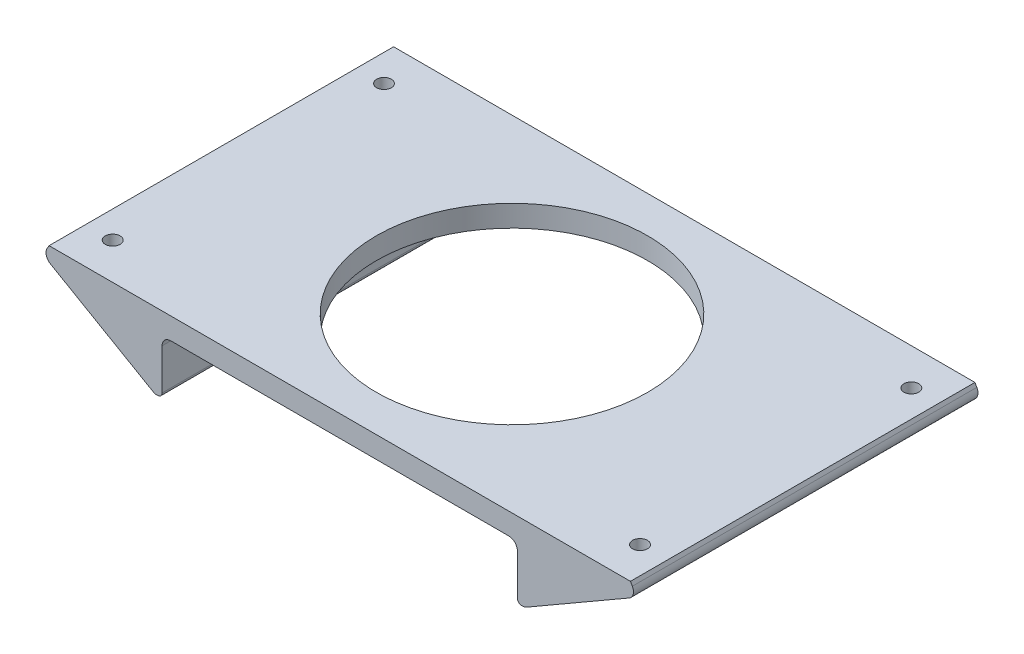
ISO-10303-21;
HEADER;
FILE_DESCRIPTION(('STEP AP214'),'2;1');
FILE_NAME('part.step','',(''),(''),'','','');
FILE_SCHEMA(('AUTOMOTIVE_DESIGN { 1 0 10303 214 1 1 1 1 }'));
ENDSEC;
DATA;
#1=APPLICATION_CONTEXT('core data for automotive mechanical design processes');
#2=APPLICATION_PROTOCOL_DEFINITION('international standard','automotive_design',2000,#1);
#3=PRODUCT_CONTEXT('',#1,'mechanical');
#4=PRODUCT('Part','Part','',(#3));
#5=PRODUCT_RELATED_PRODUCT_CATEGORY('part','',(#4));
#6=PRODUCT_DEFINITION_FORMATION('','',#4);
#7=PRODUCT_DEFINITION_CONTEXT('part definition',#1,'design');
#8=PRODUCT_DEFINITION('design','',#6,#7);
#9=PRODUCT_DEFINITION_SHAPE('','',#8);
#10=(LENGTH_UNIT() NAMED_UNIT(*) SI_UNIT(.MILLI.,.METRE.));
#11=(NAMED_UNIT(*) PLANE_ANGLE_UNIT() SI_UNIT($,.RADIAN.));
#12=(NAMED_UNIT(*) SI_UNIT($,.STERADIAN.) SOLID_ANGLE_UNIT());
#13=UNCERTAINTY_MEASURE_WITH_UNIT(LENGTH_MEASURE(1.E-05),#10,'distance_accuracy_value','');
#14=(GEOMETRIC_REPRESENTATION_CONTEXT(3) GLOBAL_UNCERTAINTY_ASSIGNED_CONTEXT((#13)) GLOBAL_UNIT_ASSIGNED_CONTEXT((#10,
#11,#12)) REPRESENTATION_CONTEXT('',''));
#15=CARTESIAN_POINT('',(0.,0.,0.));
#16=DIRECTION('',(0.,0.,1.));
#17=DIRECTION('',(1.,0.,0.));
#18=AXIS2_PLACEMENT_3D('',#15,#16,#17);
#19=CARTESIAN_POINT('',(-85.725,0.,101.6));
#20=DIRECTION('',(0.866025403784444,-0.49999999999999,0.));
#21=DIRECTION('',(0.49999999999999,0.866025403784444,0.));
#22=AXIS2_PLACEMENT_3D('',#19,#20,#21);
#23=PLANE('',#22);
#24=DIRECTION('',(-0.49999999999999,-0.866025403784444,0.));
#25=VECTOR('',#24,1.);
#26=CARTESIAN_POINT('',(-85.725,0.,0.));
#27=LINE('',#26,#25);
#28=CARTESIAN_POINT('',(-85.725,0.,0.));
#29=VERTEX_POINT('',#28);
#30=CARTESIAN_POINT('',(-86.288087104677,-0.975295474387556,0.));
#31=VERTEX_POINT('',#30);
#32=EDGE_CURVE('E205',#29,#31,#27,.T.);
#33=ORIENTED_EDGE('',*,*,#32,.T.);
#34=DIRECTION('',(0.,0.,-1.));
#35=VECTOR('',#34,1.);
#36=CARTESIAN_POINT('',(-86.288087104677,-0.975295474387557,101.6));
#37=LINE('',#36,#35);
#38=CARTESIAN_POINT('',(-86.288087104677,-0.975295474387556,101.6));
#39=VERTEX_POINT('',#38);
#40=EDGE_CURVE('E251',#31,#39,#37,.F.);
#41=ORIENTED_EDGE('',*,*,#40,.T.);
#42=DIRECTION('',(-0.49999999999999,-0.866025403784444,0.));
#43=VECTOR('',#42,1.);
#44=CARTESIAN_POINT('',(-85.725,0.,101.6));
#45=LINE('',#44,#43);
#46=CARTESIAN_POINT('',(-85.725,0.,101.6));
#47=VERTEX_POINT('',#46);
#48=EDGE_CURVE('E239',#47,#39,#45,.T.);
#49=ORIENTED_EDGE('',*,*,#48,.F.);
#50=DIRECTION('',(0.,0.,-1.));
#51=VECTOR('',#50,1.);
#52=CARTESIAN_POINT('',(-85.725,0.,101.6));
#53=LINE('',#52,#51);
#54=EDGE_CURVE('E194',#47,#29,#53,.T.);
#55=ORIENTED_EDGE('',*,*,#54,.T.);
#56=EDGE_LOOP('',(#33,#41,#49,#55));
#57=FACE_BOUND('',#56,.T.);
#58=ADVANCED_FACE('F45',(#57),#23,.F.);
#59=CARTESIAN_POINT('',(-87.558087104677,-3.17500000000003,101.6));
#60=DIRECTION('',(0.499999999999998,0.86602540378444,0.));
#61=DIRECTION('',(-0.86602540378444,0.499999999999998,0.));
#62=AXIS2_PLACEMENT_3D('',#59,#60,#61);
#63=PLANE('',#62);
#64=CARTESIAN_POINT('',(-77.75575,-8.83438196607273,10.795));
#65=DIRECTION('',(0.499999999999998,0.86602540378444,0.));
#66=DIRECTION('',(-0.86602540378444,0.499999999999998,0.));
#67=AXIS2_PLACEMENT_3D('',#64,#65,#66);
#68=ELLIPSE('',#67,2.52232785603563,2.1844);
#69=CARTESIAN_POINT('',(-79.94015,-7.57321803805492,10.795));
#70=VERTEX_POINT('',#69);
#71=EDGE_CURVE('E387',#70,#70,#68,.T.);
#72=ORIENTED_EDGE('',*,*,#71,.T.);
#73=EDGE_LOOP('',(#72));
#74=FACE_BOUND('',#73,.T.);
#75=CARTESIAN_POINT('',(-77.75575,-8.83438196607273,90.805));
#76=DIRECTION('',(0.499999999999998,0.86602540378444,0.));
#77=DIRECTION('',(-0.86602540378444,0.499999999999998,0.));
#78=AXIS2_PLACEMENT_3D('',#75,#76,#77);
#79=ELLIPSE('',#78,2.52232785603563,2.1844);
#80=CARTESIAN_POINT('',(-79.94015,-7.57321803805492,90.805));
#81=VERTEX_POINT('',#80);
#82=EDGE_CURVE('E391',#81,#81,#79,.T.);
#83=ORIENTED_EDGE('',*,*,#82,.T.);
#84=EDGE_LOOP('',(#83));
#85=FACE_BOUND('',#84,.T.);
#86=DIRECTION('',(0.86602540378444,-0.499999999999998,0.));
#87=VECTOR('',#86,1.);
#88=CARTESIAN_POINT('',(-87.558087104677,-3.17500000000003,0.));
#89=LINE('',#88,#87);
#90=CARTESIAN_POINT('',(-85.3583825790645,-4.44500000000002,0.));
#91=VERTEX_POINT('',#90);
#92=CARTESIAN_POINT('',(-54.8572237461023,-22.0548522628062,0.));
#93=VERTEX_POINT('',#92);
#94=EDGE_CURVE('E209',#91,#93,#89,.T.);
#95=ORIENTED_EDGE('',*,*,#94,.T.);
#96=DIRECTION('',(0.,0.,-1.));
#97=VECTOR('',#96,1.);
#98=CARTESIAN_POINT('',(-54.8572237461023,-22.0548522628062,101.6));
#99=LINE('',#98,#97);
#100=CARTESIAN_POINT('',(-54.8572237461023,-22.0548522628062,101.6));
#101=VERTEX_POINT('',#100);
#102=EDGE_CURVE('E313',#93,#101,#99,.F.);
#103=ORIENTED_EDGE('',*,*,#102,.T.);
#104=DIRECTION('',(0.86602540378444,-0.499999999999998,0.));
#105=VECTOR('',#104,1.);
#106=CARTESIAN_POINT('',(-87.558087104677,-3.17500000000003,101.6));
#107=LINE('',#106,#105);
#108=CARTESIAN_POINT('',(-85.3583825790645,-4.44500000000002,101.6));
#109=VERTEX_POINT('',#108);
#110=EDGE_CURVE('E375',#109,#101,#107,.T.);
#111=ORIENTED_EDGE('',*,*,#110,.F.);
#112=DIRECTION('',(0.,0.,-1.));
#113=VECTOR('',#112,1.);
#114=CARTESIAN_POINT('',(-85.3583825790645,-4.44500000000002,101.6));
#115=LINE('',#114,#113);
#116=EDGE_CURVE('E193',#109,#91,#115,.T.);
#117=ORIENTED_EDGE('',*,*,#116,.T.);
#118=EDGE_LOOP('',(#95,#103,#111,#117));
#119=FACE_BOUND('',#118,.T.);
#120=ADVANCED_FACE('F446',(#74,#85,#119),#63,.F.);
#121=CARTESIAN_POINT('',(-54.5625192204899,-22.2249999999999,101.6));
#122=DIRECTION('',(0.,1.,0.));
#123=DIRECTION('',(-1.,0.,0.));
#124=AXIS2_PLACEMENT_3D('',#121,#122,#123);
#125=PLANE('',#124);
#126=DIRECTION('',(1.,0.,0.));
#127=VECTOR('',#126,1.);
#128=CARTESIAN_POINT('',(-54.5625192204899,-22.2249999999999,101.6));
#129=LINE('',#128,#127);
#130=CARTESIAN_POINT('',(-54.2222237461023,-22.2249999999999,101.6));
#131=VERTEX_POINT('',#130);
#132=CARTESIAN_POINT('',(-53.6575,-22.2249999999999,101.6));
#133=VERTEX_POINT('',#132);
#134=EDGE_CURVE('E371',#131,#133,#129,.T.);
#135=ORIENTED_EDGE('',*,*,#134,.F.);
#136=DIRECTION('',(0.,0.,-1.));
#137=VECTOR('',#136,1.);
#138=CARTESIAN_POINT('',(-54.2222237461023,-22.2249999999999,101.6));
#139=LINE('',#138,#137);
#140=CARTESIAN_POINT('',(-54.2222237461023,-22.2249999999999,0.));
#141=VERTEX_POINT('',#140);
#142=EDGE_CURVE('E297',#131,#141,#139,.T.);
#143=ORIENTED_EDGE('',*,*,#142,.T.);
#144=DIRECTION('',(1.,0.,0.));
#145=VECTOR('',#144,1.);
#146=CARTESIAN_POINT('',(-54.5625192204899,-22.2249999999999,0.));
#147=LINE('',#146,#145);
#148=CARTESIAN_POINT('',(-53.6575,-22.2249999999999,0.));
#149=VERTEX_POINT('',#148);
#150=EDGE_CURVE('E214',#141,#149,#147,.T.);
#151=ORIENTED_EDGE('',*,*,#150,.T.);
#152=DIRECTION('',(0.,0.,-1.));
#153=VECTOR('',#152,1.);
#154=CARTESIAN_POINT('',(-53.6575,-22.2249999999999,101.6));
#155=LINE('',#154,#153);
#156=EDGE_CURVE('E294',#149,#133,#155,.F.);
#157=ORIENTED_EDGE('',*,*,#156,.T.);
#158=EDGE_LOOP('',(#135,#143,#151,#157));
#159=FACE_BOUND('',#158,.T.);
#160=ADVANCED_FACE('F452',(#159),#125,.F.);
#161=CARTESIAN_POINT('',(-52.3875,-22.2249999999999,101.6));
#162=DIRECTION('',(-1.,0.,0.));
#163=DIRECTION('',(0.,-1.,0.));
#164=AXIS2_PLACEMENT_3D('',#161,#162,#163);
#165=PLANE('',#164);
#166=DIRECTION('',(0.,1.,0.));
#167=VECTOR('',#166,1.);
#168=CARTESIAN_POINT('',(-52.3875,-22.2249999999999,101.6));
#169=LINE('',#168,#167);
#170=CARTESIAN_POINT('',(-52.3875,-20.9549999999999,101.6));
#171=VERTEX_POINT('',#170);
#172=CARTESIAN_POINT('',(-52.3875,-8.89000000000002,101.6));
#173=VERTEX_POINT('',#172);
#174=EDGE_CURVE('E368',#171,#173,#169,.T.);
#175=ORIENTED_EDGE('',*,*,#174,.F.);
#176=DIRECTION('',(0.,0.,-1.));
#177=VECTOR('',#176,1.);
#178=CARTESIAN_POINT('',(-52.3875,-20.9549999999999,101.6));
#179=LINE('',#178,#177);
#180=CARTESIAN_POINT('',(-52.3875,-20.9549999999999,0.));
#181=VERTEX_POINT('',#180);
#182=EDGE_CURVE('E327',#171,#181,#179,.T.);
#183=ORIENTED_EDGE('',*,*,#182,.T.);
#184=DIRECTION('',(0.,1.,0.));
#185=VECTOR('',#184,1.);
#186=CARTESIAN_POINT('',(-52.3875,-22.2249999999999,0.));
#187=LINE('',#186,#185);
#188=CARTESIAN_POINT('',(-52.3875,-8.89000000000002,0.));
#189=VERTEX_POINT('',#188);
#190=EDGE_CURVE('E218',#181,#189,#187,.T.);
#191=ORIENTED_EDGE('',*,*,#190,.T.);
#192=DIRECTION('',(0.,0.,-1.));
#193=VECTOR('',#192,1.);
#194=CARTESIAN_POINT('',(-52.3875,-8.89000000000002,101.6));
#195=LINE('',#194,#193);
#196=EDGE_CURVE('E273',#189,#173,#195,.F.);
#197=ORIENTED_EDGE('',*,*,#196,.T.);
#198=EDGE_LOOP('',(#175,#183,#191,#197));
#199=FACE_BOUND('',#198,.T.);
#200=ADVANCED_FACE('F503',(#199),#165,.F.);
#201=CARTESIAN_POINT('',(-52.3875,-6.35000000000002,101.6));
#202=DIRECTION('',(0.,1.,0.));
#203=DIRECTION('',(-1.,0.,0.));
#204=AXIS2_PLACEMENT_3D('',#201,#202,#203);
#205=PLANE('',#204);
#206=CARTESIAN_POINT('',(0.,-6.34999999999999,50.8));
#207=DIRECTION('',(0.,1.,0.));
#208=DIRECTION('',(-1.,0.,0.));
#209=AXIS2_PLACEMENT_3D('',#206,#207,#208);
#210=CIRCLE('',#209,40.005);
#211=CARTESIAN_POINT('',(-40.005,-6.35000000000001,50.8));
#212=VERTEX_POINT('',#211);
#213=EDGE_CURVE('E210',#212,#212,#210,.T.);
#214=ORIENTED_EDGE('',*,*,#213,.T.);
#215=EDGE_LOOP('',(#214));
#216=FACE_BOUND('',#215,.T.);
#217=DIRECTION('',(1.,0.,0.));
#218=VECTOR('',#217,1.);
#219=CARTESIAN_POINT('',(-52.3875,-6.35000000000002,101.6));
#220=LINE('',#219,#218);
#221=CARTESIAN_POINT('',(-49.8475,-6.35000000000002,101.6));
#222=VERTEX_POINT('',#221);
#223=CARTESIAN_POINT('',(49.8475,-6.34999999999996,101.6));
#224=VERTEX_POINT('',#223);
#225=EDGE_CURVE('E364',#222,#224,#220,.T.);
#226=ORIENTED_EDGE('',*,*,#225,.F.);
#227=DIRECTION('',(0.,0.,-1.));
#228=VECTOR('',#227,1.);
#229=CARTESIAN_POINT('',(-49.8475,-6.35000000000002,0.));
#230=LINE('',#229,#228);
#231=CARTESIAN_POINT('',(-49.8475,-6.35000000000002,0.));
#232=VERTEX_POINT('',#231);
#233=EDGE_CURVE('E269',#222,#232,#230,.T.);
#234=ORIENTED_EDGE('',*,*,#233,.T.);
#235=DIRECTION('',(1.,0.,0.));
#236=VECTOR('',#235,1.);
#237=CARTESIAN_POINT('',(-52.3875,-6.35000000000002,0.));
#238=LINE('',#237,#236);
#239=CARTESIAN_POINT('',(49.8475,-6.34999999999996,0.));
#240=VERTEX_POINT('',#239);
#241=EDGE_CURVE('E221',#232,#240,#238,.T.);
#242=ORIENTED_EDGE('',*,*,#241,.T.);
#243=DIRECTION('',(0.,0.,-1.));
#244=VECTOR('',#243,1.);
#245=CARTESIAN_POINT('',(49.8475,-6.34999999999996,101.6));
#246=LINE('',#245,#244);
#247=EDGE_CURVE('E266',#240,#224,#246,.F.);
#248=ORIENTED_EDGE('',*,*,#247,.T.);
#249=EDGE_LOOP('',(#226,#234,#242,#248));
#250=FACE_BOUND('',#249,.T.);
#251=ADVANCED_FACE('F496',(#216,#250),#205,.F.);
#252=CARTESIAN_POINT('',(52.3875,-22.2249999999999,101.6));
#253=DIRECTION('',(1.,0.,0.));
#254=DIRECTION('',(0.,1.,0.));
#255=AXIS2_PLACEMENT_3D('',#252,#253,#254);
#256=PLANE('',#255);
#257=DIRECTION('',(0.,-1.,0.));
#258=VECTOR('',#257,1.);
#259=CARTESIAN_POINT('',(52.3875,-22.2249999999999,0.));
#260=LINE('',#259,#258);
#261=CARTESIAN_POINT('',(52.3875,-8.88999999999996,0.));
#262=VERTEX_POINT('',#261);
#263=CARTESIAN_POINT('',(52.3875,-20.9549999999999,0.));
#264=VERTEX_POINT('',#263);
#265=EDGE_CURVE('E225',#262,#264,#260,.T.);
#266=ORIENTED_EDGE('',*,*,#265,.T.);
#267=DIRECTION('',(0.,0.,-1.));
#268=VECTOR('',#267,1.);
#269=CARTESIAN_POINT('',(52.3875,-20.9549999999999,101.6));
#270=LINE('',#269,#268);
#271=CARTESIAN_POINT('',(52.3875,-20.9549999999999,101.6));
#272=VERTEX_POINT('',#271);
#273=EDGE_CURVE('E11',#264,#272,#270,.F.);
#274=ORIENTED_EDGE('',*,*,#273,.T.);
#275=DIRECTION('',(0.,-1.,0.));
#276=VECTOR('',#275,1.);
#277=CARTESIAN_POINT('',(52.3875,-22.2249999999999,101.6));
#278=LINE('',#277,#276);
#279=CARTESIAN_POINT('',(52.3875,-8.88999999999996,101.6));
#280=VERTEX_POINT('',#279);
#281=EDGE_CURVE('E358',#280,#272,#278,.T.);
#282=ORIENTED_EDGE('',*,*,#281,.F.);
#283=DIRECTION('',(0.,0.,-1.));
#284=VECTOR('',#283,1.);
#285=CARTESIAN_POINT('',(52.3875,-8.88999999999996,0.));
#286=LINE('',#285,#284);
#287=EDGE_CURVE('E277',#280,#262,#286,.T.);
#288=ORIENTED_EDGE('',*,*,#287,.T.);
#289=EDGE_LOOP('',(#266,#274,#282,#288));
#290=FACE_BOUND('',#289,.T.);
#291=ADVANCED_FACE('F443',(#290),#256,.F.);
#292=CARTESIAN_POINT('',(54.5625192204899,-22.2249999999999,101.6));
#293=DIRECTION('',(0.,1.,0.));
#294=DIRECTION('',(-1.,0.,0.));
#295=AXIS2_PLACEMENT_3D('',#292,#293,#294);
#296=PLANE('',#295);
#297=DIRECTION('',(1.,0.,0.));
#298=VECTOR('',#297,1.);
#299=CARTESIAN_POINT('',(54.5625192204899,-22.2249999999999,0.));
#300=LINE('',#299,#298);
#301=CARTESIAN_POINT('',(53.6575,-22.2249999999999,0.));
#302=VERTEX_POINT('',#301);
#303=CARTESIAN_POINT('',(54.2222237461023,-22.2249999999999,0.));
#304=VERTEX_POINT('',#303);
#305=EDGE_CURVE('E229',#302,#304,#300,.T.);
#306=ORIENTED_EDGE('',*,*,#305,.T.);
#307=DIRECTION('',(0.,0.,-1.));
#308=VECTOR('',#307,1.);
#309=CARTESIAN_POINT('',(54.2222237461023,-22.2249999999999,101.6));
#310=LINE('',#309,#308);
#311=CARTESIAN_POINT('',(54.2222237461023,-22.2249999999999,101.6));
#312=VERTEX_POINT('',#311);
#313=EDGE_CURVE('E54',#304,#312,#310,.F.);
#314=ORIENTED_EDGE('',*,*,#313,.T.);
#315=DIRECTION('',(1.,0.,0.));
#316=VECTOR('',#315,1.);
#317=CARTESIAN_POINT('',(54.5625192204899,-22.2249999999999,101.6));
#318=LINE('',#317,#316);
#319=CARTESIAN_POINT('',(53.6575,-22.2249999999999,101.6));
#320=VERTEX_POINT('',#319);
#321=EDGE_CURVE('E342',#320,#312,#318,.T.);
#322=ORIENTED_EDGE('',*,*,#321,.F.);
#323=DIRECTION('',(0.,0.,-1.));
#324=VECTOR('',#323,1.);
#325=CARTESIAN_POINT('',(53.6575,-22.2249999999999,101.6));
#326=LINE('',#325,#324);
#327=EDGE_CURVE('E335',#320,#302,#326,.T.);
#328=ORIENTED_EDGE('',*,*,#327,.T.);
#329=EDGE_LOOP('',(#306,#314,#322,#328));
#330=FACE_BOUND('',#329,.T.);
#331=ADVANCED_FACE('F341',(#330),#296,.F.);
#332=CARTESIAN_POINT('',(87.558087104677,-3.17500000000001,101.6));
#333=DIRECTION('',(-0.499999999999998,0.86602540378444,0.));
#334=DIRECTION('',(-0.86602540378444,-0.499999999999998,0.));
#335=AXIS2_PLACEMENT_3D('',#332,#333,#334);
#336=PLANE('',#335);
#337=CARTESIAN_POINT('',(77.75575,-8.83438196607271,10.795));
#338=DIRECTION('',(-0.499999999999998,0.86602540378444,0.));
#339=DIRECTION('',(0.86602540378444,0.499999999999998,0.));
#340=AXIS2_PLACEMENT_3D('',#337,#338,#339);
#341=ELLIPSE('',#340,2.52232785603563,2.1844);
#342=CARTESIAN_POINT('',(79.94015,-7.5732180380549,10.795));
#343=VERTEX_POINT('',#342);
#344=EDGE_CURVE('E383',#343,#343,#341,.T.);
#345=ORIENTED_EDGE('',*,*,#344,.T.);
#346=EDGE_LOOP('',(#345));
#347=FACE_BOUND('',#346,.T.);
#348=CARTESIAN_POINT('',(77.75575,-8.8343819660727,90.805));
#349=DIRECTION('',(-0.499999999999998,0.86602540378444,0.));
#350=DIRECTION('',(0.86602540378444,0.499999999999998,0.));
#351=AXIS2_PLACEMENT_3D('',#348,#349,#350);
#352=ELLIPSE('',#351,2.52232785603563,2.1844);
#353=CARTESIAN_POINT('',(79.94015,-7.57321803805489,90.805));
#354=VERTEX_POINT('',#353);
#355=EDGE_CURVE('E395',#354,#354,#352,.T.);
#356=ORIENTED_EDGE('',*,*,#355,.T.);
#357=EDGE_LOOP('',(#356));
#358=FACE_BOUND('',#357,.T.);
#359=DIRECTION('',(0.86602540378444,0.499999999999998,0.));
#360=VECTOR('',#359,1.);
#361=CARTESIAN_POINT('',(87.558087104677,-3.17500000000001,101.6));
#362=LINE('',#361,#360);
#363=CARTESIAN_POINT('',(54.8572237461023,-22.0548522628061,101.6));
#364=VERTEX_POINT('',#363);
#365=CARTESIAN_POINT('',(85.3583825790645,-4.44499999999999,101.6));
#366=VERTEX_POINT('',#365);
#367=EDGE_CURVE('E183',#364,#366,#362,.T.);
#368=ORIENTED_EDGE('',*,*,#367,.F.);
#369=DIRECTION('',(0.,0.,-1.));
#370=VECTOR('',#369,1.);
#371=CARTESIAN_POINT('',(54.8572237461023,-22.0548522628062,101.6));
#372=LINE('',#371,#370);
#373=CARTESIAN_POINT('',(54.8572237461023,-22.0548522628061,0.));
#374=VERTEX_POINT('',#373);
#375=EDGE_CURVE('E331',#364,#374,#372,.T.);
#376=ORIENTED_EDGE('',*,*,#375,.T.);
#377=DIRECTION('',(0.86602540378444,0.499999999999998,0.));
#378=VECTOR('',#377,1.);
#379=CARTESIAN_POINT('',(87.558087104677,-3.17500000000001,0.));
#380=LINE('',#379,#378);
#381=CARTESIAN_POINT('',(85.3583825790645,-4.44499999999999,0.));
#382=VERTEX_POINT('',#381);
#383=EDGE_CURVE('E232',#374,#382,#380,.T.);
#384=ORIENTED_EDGE('',*,*,#383,.T.);
#385=DIRECTION('',(0.,0.,-1.));
#386=VECTOR('',#385,1.);
#387=CARTESIAN_POINT('',(85.3583825790645,-4.44499999999999,101.6));
#388=LINE('',#387,#386);
#389=EDGE_CURVE('E262',#382,#366,#388,.F.);
#390=ORIENTED_EDGE('',*,*,#389,.T.);
#391=EDGE_LOOP('',(#368,#376,#384,#390));
#392=FACE_BOUND('',#391,.T.);
#393=ADVANCED_FACE('F354',(#347,#358,#392),#336,.F.);
#394=CARTESIAN_POINT('',(85.725,0.,101.6));
#395=DIRECTION('',(-0.866025403784443,-0.499999999999993,0.));
#396=DIRECTION('',(0.499999999999993,-0.866025403784443,0.));
#397=AXIS2_PLACEMENT_3D('',#394,#395,#396);
#398=PLANE('',#397);
#399=DIRECTION('',(-0.499999999999993,0.866025403784443,0.));
#400=VECTOR('',#399,1.);
#401=CARTESIAN_POINT('',(85.725,0.,101.6));
#402=LINE('',#401,#400);
#403=CARTESIAN_POINT('',(86.288087104677,-0.975295474387529,101.6));
#404=VERTEX_POINT('',#403);
#405=CARTESIAN_POINT('',(85.725,0.,101.6));
#406=VERTEX_POINT('',#405);
#407=EDGE_CURVE('E169',#404,#406,#402,.T.);
#408=ORIENTED_EDGE('',*,*,#407,.F.);
#409=DIRECTION('',(0.,0.,-1.));
#410=VECTOR('',#409,1.);
#411=CARTESIAN_POINT('',(86.288087104677,-0.975295474387531,101.6));
#412=LINE('',#411,#410);
#413=CARTESIAN_POINT('',(86.288087104677,-0.975295474387529,0.));
#414=VERTEX_POINT('',#413);
#415=EDGE_CURVE('E259',#404,#414,#412,.T.);
#416=ORIENTED_EDGE('',*,*,#415,.T.);
#417=DIRECTION('',(-0.499999999999993,0.866025403784443,0.));
#418=VECTOR('',#417,1.);
#419=CARTESIAN_POINT('',(85.725,0.,0.));
#420=LINE('',#419,#418);
#421=CARTESIAN_POINT('',(85.725,0.,0.));
#422=VERTEX_POINT('',#421);
#423=EDGE_CURVE('E189',#414,#422,#420,.T.);
#424=ORIENTED_EDGE('',*,*,#423,.T.);
#425=DIRECTION('',(0.,0.,-1.));
#426=VECTOR('',#425,1.);
#427=CARTESIAN_POINT('',(85.725,0.,101.6));
#428=LINE('',#427,#426);
#429=EDGE_CURVE('E186',#406,#422,#428,.T.);
#430=ORIENTED_EDGE('',*,*,#429,.F.);
#431=EDGE_LOOP('',(#408,#416,#424,#430));
#432=FACE_BOUND('',#431,.T.);
#433=ADVANCED_FACE('F187',(#432),#398,.F.);
#434=CARTESIAN_POINT('',(85.725,0.,101.6));
#435=DIRECTION('',(0.,-1.,0.));
#436=DIRECTION('',(1.,0.,0.));
#437=AXIS2_PLACEMENT_3D('',#434,#435,#436);
#438=PLANE('',#437);
#439=CARTESIAN_POINT('',(0.,0.,50.8));
#440=DIRECTION('',(0.,1.,0.));
#441=DIRECTION('',(-1.,0.,0.));
#442=AXIS2_PLACEMENT_3D('',#439,#440,#441);
#443=CIRCLE('',#442,40.005);
#444=CARTESIAN_POINT('',(-40.005,0.,50.8));
#445=VERTEX_POINT('',#444);
#446=EDGE_CURVE('E404',#445,#445,#443,.T.);
#447=ORIENTED_EDGE('',*,*,#446,.F.);
#448=EDGE_LOOP('',(#447));
#449=FACE_BOUND('',#448,.T.);
#450=CARTESIAN_POINT('',(77.75575,0.,10.795));
#451=DIRECTION('',(0.,1.,0.));
#452=DIRECTION('',(1.,0.,0.));
#453=AXIS2_PLACEMENT_3D('',#450,#451,#452);
#454=CIRCLE('',#453,2.1844);
#455=CARTESIAN_POINT('',(79.94015,0.,10.795));
#456=VERTEX_POINT('',#455);
#457=EDGE_CURVE('E408',#456,#456,#454,.T.);
#458=ORIENTED_EDGE('',*,*,#457,.F.);
#459=EDGE_LOOP('',(#458));
#460=FACE_BOUND('',#459,.T.);
#461=CARTESIAN_POINT('',(-77.75575,0.,10.795));
#462=DIRECTION('',(0.,1.,0.));
#463=DIRECTION('',(-1.,0.,0.));
#464=AXIS2_PLACEMENT_3D('',#461,#462,#463);
#465=CIRCLE('',#464,2.1844);
#466=CARTESIAN_POINT('',(-79.94015,0.,10.795));
#467=VERTEX_POINT('',#466);
#468=EDGE_CURVE('E412',#467,#467,#465,.T.);
#469=ORIENTED_EDGE('',*,*,#468,.F.);
#470=EDGE_LOOP('',(#469));
#471=FACE_BOUND('',#470,.T.);
#472=CARTESIAN_POINT('',(-77.75575,0.,90.805));
#473=DIRECTION('',(0.,1.,0.));
#474=DIRECTION('',(1.,0.,0.));
#475=AXIS2_PLACEMENT_3D('',#472,#473,#474);
#476=CIRCLE('',#475,2.1844);
#477=CARTESIAN_POINT('',(-75.57135,0.,90.805));
#478=VERTEX_POINT('',#477);
#479=EDGE_CURVE('E403',#478,#478,#476,.T.);
#480=ORIENTED_EDGE('',*,*,#479,.F.);
#481=EDGE_LOOP('',(#480));
#482=FACE_BOUND('',#481,.T.);
#483=CARTESIAN_POINT('',(77.75575,0.,90.805));
#484=DIRECTION('',(0.,1.,0.));
#485=DIRECTION('',(-1.,0.,0.));
#486=AXIS2_PLACEMENT_3D('',#483,#484,#485);
#487=CIRCLE('',#486,2.1844);
#488=CARTESIAN_POINT('',(75.57135,0.,90.805));
#489=VERTEX_POINT('',#488);
#490=EDGE_CURVE('E399',#489,#489,#487,.T.);
#491=ORIENTED_EDGE('',*,*,#490,.F.);
#492=EDGE_LOOP('',(#491));
#493=FACE_BOUND('',#492,.T.);
#494=DIRECTION('',(-1.,0.,0.));
#495=VECTOR('',#494,1.);
#496=CARTESIAN_POINT('',(85.725,0.,0.));
#497=LINE('',#496,#495);
#498=EDGE_CURVE('E237',#422,#29,#497,.T.);
#499=ORIENTED_EDGE('',*,*,#498,.T.);
#500=ORIENTED_EDGE('',*,*,#54,.F.);
#501=DIRECTION('',(-1.,0.,0.));
#502=VECTOR('',#501,1.);
#503=CARTESIAN_POINT('',(85.725,0.,101.6));
#504=LINE('',#503,#502);
#505=EDGE_CURVE('E175',#406,#47,#504,.T.);
#506=ORIENTED_EDGE('',*,*,#505,.F.);
#507=ORIENTED_EDGE('',*,*,#429,.T.);
#508=EDGE_LOOP('',(#499,#500,#506,#507));
#509=FACE_BOUND('',#508,.T.);
#510=ADVANCED_FACE('F196',(#449,#460,#471,#482,#493,#509),#438,.F.);
#511=CARTESIAN_POINT('',(0.,0.,101.6));
#512=DIRECTION('',(0.,0.,1.));
#513=DIRECTION('',(1.,0.,0.));
#514=AXIS2_PLACEMENT_3D('',#511,#512,#513);
#515=PLANE('',#514);
#516=ORIENTED_EDGE('',*,*,#110,.T.);
#517=CARTESIAN_POINT('',(-54.2222237461023,-20.9549999999999,101.6));
#518=DIRECTION('',(0.,0.,1.));
#519=DIRECTION('',(1.,0.,0.));
#520=AXIS2_PLACEMENT_3D('',#517,#518,#519);
#521=CIRCLE('',#520,1.27);
#522=EDGE_CURVE('E324',#101,#131,#521,.T.);
#523=ORIENTED_EDGE('',*,*,#522,.T.);
#524=ORIENTED_EDGE('',*,*,#134,.T.);
#525=CARTESIAN_POINT('',(-53.6575,-20.9549999999999,101.6));
#526=DIRECTION('',(0.,0.,1.));
#527=DIRECTION('',(1.,0.,0.));
#528=AXIS2_PLACEMENT_3D('',#525,#526,#527);
#529=CIRCLE('',#528,1.27);
#530=EDGE_CURVE('E321',#133,#171,#529,.T.);
#531=ORIENTED_EDGE('',*,*,#530,.T.);
#532=ORIENTED_EDGE('',*,*,#174,.T.);
#533=CARTESIAN_POINT('',(-49.8475,-8.89000000000002,101.6));
#534=DIRECTION('',(0.,0.,1.));
#535=DIRECTION('',(1.,0.,0.));
#536=AXIS2_PLACEMENT_3D('',#533,#534,#535);
#537=CIRCLE('',#536,2.54);
#538=EDGE_CURVE('E285',#173,#222,#537,.F.);
#539=ORIENTED_EDGE('',*,*,#538,.T.);
#540=ORIENTED_EDGE('',*,*,#225,.T.);
#541=CARTESIAN_POINT('',(49.8475,-8.88999999999996,101.6));
#542=DIRECTION('',(0.,0.,1.));
#543=DIRECTION('',(1.,0.,0.));
#544=AXIS2_PLACEMENT_3D('',#541,#542,#543);
#545=CIRCLE('',#544,2.54);
#546=EDGE_CURVE('E291',#224,#280,#545,.F.);
#547=ORIENTED_EDGE('',*,*,#546,.T.);
#548=ORIENTED_EDGE('',*,*,#281,.T.);
#549=CARTESIAN_POINT('',(53.6575,-20.9549999999999,101.6));
#550=DIRECTION('',(0.,0.,1.));
#551=DIRECTION('',(1.,0.,0.));
#552=AXIS2_PLACEMENT_3D('',#549,#550,#551);
#553=CIRCLE('',#552,1.27);
#554=EDGE_CURVE('E316',#272,#320,#553,.T.);
#555=ORIENTED_EDGE('',*,*,#554,.T.);
#556=ORIENTED_EDGE('',*,*,#321,.T.);
#557=CARTESIAN_POINT('',(54.2222237461023,-20.9549999999999,101.6));
#558=DIRECTION('',(0.,0.,1.));
#559=DIRECTION('',(1.,0.,0.));
#560=AXIS2_PLACEMENT_3D('',#557,#558,#559);
#561=CIRCLE('',#560,1.27);
#562=EDGE_CURVE('E61',#312,#364,#561,.T.);
#563=ORIENTED_EDGE('',*,*,#562,.T.);
#564=ORIENTED_EDGE('',*,*,#367,.T.);
#565=CARTESIAN_POINT('',(84.0883825790645,-2.24529547438751,101.6));
#566=DIRECTION('',(0.,0.,1.));
#567=DIRECTION('',(1.,0.,0.));
#568=AXIS2_PLACEMENT_3D('',#565,#566,#567);
#569=CIRCLE('',#568,2.54);
#570=EDGE_CURVE('E178',#366,#404,#569,.T.);
#571=ORIENTED_EDGE('',*,*,#570,.T.);
#572=ORIENTED_EDGE('',*,*,#407,.T.);
#573=ORIENTED_EDGE('',*,*,#505,.T.);
#574=ORIENTED_EDGE('',*,*,#48,.T.);
#575=CARTESIAN_POINT('',(-84.0883825790645,-2.24529547438754,101.6));
#576=DIRECTION('',(0.,0.,1.));
#577=DIRECTION('',(1.,0.,0.));
#578=AXIS2_PLACEMENT_3D('',#575,#576,#577);
#579=CIRCLE('',#578,2.54);
#580=EDGE_CURVE('E256',#39,#109,#579,.T.);
#581=ORIENTED_EDGE('',*,*,#580,.T.);
#582=EDGE_LOOP('',(#516,#523,#524,#531,#532,#539,#540,#547,#548,#555,#556,#563,#564,#571,#572,
#573,#574,#581));
#583=FACE_BOUND('',#582,.T.);
#584=ADVANCED_FACE('F172',(#583),#515,.T.);
#585=CARTESIAN_POINT('',(0.,0.,0.));
#586=DIRECTION('',(0.,0.,1.));
#587=DIRECTION('',(1.,0.,0.));
#588=AXIS2_PLACEMENT_3D('',#585,#586,#587);
#589=PLANE('',#588);
#590=ORIENTED_EDGE('',*,*,#150,.F.);
#591=CARTESIAN_POINT('',(-54.2222237461023,-20.9549999999999,0.));
#592=DIRECTION('',(0.,0.,1.));
#593=DIRECTION('',(1.,0.,0.));
#594=AXIS2_PLACEMENT_3D('',#591,#592,#593);
#595=CIRCLE('',#594,1.27);
#596=EDGE_CURVE('E310',#141,#93,#595,.F.);
#597=ORIENTED_EDGE('',*,*,#596,.T.);
#598=ORIENTED_EDGE('',*,*,#94,.F.);
#599=CARTESIAN_POINT('',(-84.0883825790645,-2.24529547438754,0.));
#600=DIRECTION('',(0.,0.,1.));
#601=DIRECTION('',(1.,0.,0.));
#602=AXIS2_PLACEMENT_3D('',#599,#600,#601);
#603=CIRCLE('',#602,2.54);
#604=EDGE_CURVE('E248',#91,#31,#603,.F.);
#605=ORIENTED_EDGE('',*,*,#604,.T.);
#606=ORIENTED_EDGE('',*,*,#32,.F.);
#607=ORIENTED_EDGE('',*,*,#498,.F.);
#608=ORIENTED_EDGE('',*,*,#423,.F.);
#609=CARTESIAN_POINT('',(84.0883825790645,-2.24529547438751,0.));
#610=DIRECTION('',(0.,0.,1.));
#611=DIRECTION('',(1.,0.,0.));
#612=AXIS2_PLACEMENT_3D('',#609,#610,#611);
#613=CIRCLE('',#612,2.54);
#614=EDGE_CURVE('E244',#414,#382,#613,.F.);
#615=ORIENTED_EDGE('',*,*,#614,.T.);
#616=ORIENTED_EDGE('',*,*,#383,.F.);
#617=CARTESIAN_POINT('',(54.2222237461023,-20.9549999999999,0.));
#618=DIRECTION('',(0.,0.,1.));
#619=DIRECTION('',(1.,0.,0.));
#620=AXIS2_PLACEMENT_3D('',#617,#618,#619);
#621=CIRCLE('',#620,1.27);
#622=EDGE_CURVE('E304',#374,#304,#621,.F.);
#623=ORIENTED_EDGE('',*,*,#622,.T.);
#624=ORIENTED_EDGE('',*,*,#305,.F.);
#625=CARTESIAN_POINT('',(53.6575,-20.9549999999999,0.));
#626=DIRECTION('',(0.,0.,1.));
#627=DIRECTION('',(1.,0.,0.));
#628=AXIS2_PLACEMENT_3D('',#625,#626,#627);
#629=CIRCLE('',#628,1.27);
#630=EDGE_CURVE('E301',#302,#264,#629,.F.);
#631=ORIENTED_EDGE('',*,*,#630,.T.);
#632=ORIENTED_EDGE('',*,*,#265,.F.);
#633=CARTESIAN_POINT('',(49.8475,-8.88999999999996,0.));
#634=DIRECTION('',(0.,0.,1.));
#635=DIRECTION('',(1.,0.,0.));
#636=AXIS2_PLACEMENT_3D('',#633,#634,#635);
#637=CIRCLE('',#636,2.54);
#638=EDGE_CURVE('E288',#262,#240,#637,.T.);
#639=ORIENTED_EDGE('',*,*,#638,.T.);
#640=ORIENTED_EDGE('',*,*,#241,.F.);
#641=CARTESIAN_POINT('',(-49.8475,-8.89000000000002,0.));
#642=DIRECTION('',(0.,0.,1.));
#643=DIRECTION('',(1.,0.,0.));
#644=AXIS2_PLACEMENT_3D('',#641,#642,#643);
#645=CIRCLE('',#644,2.54);
#646=EDGE_CURVE('E281',#232,#189,#645,.T.);
#647=ORIENTED_EDGE('',*,*,#646,.T.);
#648=ORIENTED_EDGE('',*,*,#190,.F.);
#649=CARTESIAN_POINT('',(-53.6575,-20.9549999999999,0.));
#650=DIRECTION('',(0.,0.,1.));
#651=DIRECTION('',(1.,0.,0.));
#652=AXIS2_PLACEMENT_3D('',#649,#650,#651);
#653=CIRCLE('',#652,1.27);
#654=EDGE_CURVE('E307',#181,#149,#653,.F.);
#655=ORIENTED_EDGE('',*,*,#654,.T.);
#656=EDGE_LOOP('',(#590,#597,#598,#605,#606,#607,#608,#615,#616,#623,#624,#631,#632,#639,#640,
#647,#648,#655));
#657=FACE_BOUND('',#656,.T.);
#658=ADVANCED_FACE('F347',(#657),#589,.F.);
#659=CARTESIAN_POINT('',(77.75575,-22.2249999999999,90.805));
#660=DIRECTION('',(0.,1.,0.));
#661=DIRECTION('',(-1.,0.,0.));
#662=AXIS2_PLACEMENT_3D('',#659,#660,#661);
#663=CYLINDRICAL_SURFACE('',#662,2.1844);
#664=ORIENTED_EDGE('',*,*,#490,.T.);
#665=EDGE_LOOP('',(#664));
#666=FACE_BOUND('',#665,.T.);
#667=ORIENTED_EDGE('',*,*,#355,.F.);
#668=EDGE_LOOP('',(#667));
#669=FACE_BOUND('',#668,.T.);
#670=ADVANCED_FACE('F429',(#666,#669),#663,.F.);
#671=CARTESIAN_POINT('',(-77.75575,-22.225,90.805));
#672=DIRECTION('',(0.,1.,0.));
#673=DIRECTION('',(-1.,0.,0.));
#674=AXIS2_PLACEMENT_3D('',#671,#672,#673);
#675=CYLINDRICAL_SURFACE('',#674,2.1844);
#676=ORIENTED_EDGE('',*,*,#479,.T.);
#677=EDGE_LOOP('',(#676));
#678=FACE_BOUND('',#677,.T.);
#679=ORIENTED_EDGE('',*,*,#82,.F.);
#680=EDGE_LOOP('',(#679));
#681=FACE_BOUND('',#680,.T.);
#682=ADVANCED_FACE('F420',(#678,#681),#675,.F.);
#683=CARTESIAN_POINT('',(-77.75575,-22.225,10.795));
#684=DIRECTION('',(0.,1.,0.));
#685=DIRECTION('',(-1.,0.,0.));
#686=AXIS2_PLACEMENT_3D('',#683,#684,#685);
#687=CYLINDRICAL_SURFACE('',#686,2.1844);
#688=ORIENTED_EDGE('',*,*,#468,.T.);
#689=EDGE_LOOP('',(#688));
#690=FACE_BOUND('',#689,.T.);
#691=ORIENTED_EDGE('',*,*,#71,.F.);
#692=EDGE_LOOP('',(#691));
#693=FACE_BOUND('',#692,.T.);
#694=ADVANCED_FACE('F587',(#690,#693),#687,.F.);
#695=CARTESIAN_POINT('',(77.75575,-22.2249999999999,10.795));
#696=DIRECTION('',(0.,1.,0.));
#697=DIRECTION('',(-1.,0.,0.));
#698=AXIS2_PLACEMENT_3D('',#695,#696,#697);
#699=CYLINDRICAL_SURFACE('',#698,2.1844);
#700=ORIENTED_EDGE('',*,*,#457,.T.);
#701=EDGE_LOOP('',(#700));
#702=FACE_BOUND('',#701,.T.);
#703=ORIENTED_EDGE('',*,*,#344,.F.);
#704=EDGE_LOOP('',(#703));
#705=FACE_BOUND('',#704,.T.);
#706=ADVANCED_FACE('F596',(#702,#705),#699,.F.);
#707=CARTESIAN_POINT('',(0.,-22.2249999999999,50.8));
#708=DIRECTION('',(0.,1.,0.));
#709=DIRECTION('',(-1.,0.,0.));
#710=AXIS2_PLACEMENT_3D('',#707,#708,#709);
#711=CYLINDRICAL_SURFACE('',#710,40.005);
#712=ORIENTED_EDGE('',*,*,#446,.T.);
#713=EDGE_LOOP('',(#712));
#714=FACE_BOUND('',#713,.T.);
#715=ORIENTED_EDGE('',*,*,#213,.F.);
#716=EDGE_LOOP('',(#715));
#717=FACE_BOUND('',#716,.T.);
#718=ADVANCED_FACE('F461',(#714,#717),#711,.F.);
#719=CARTESIAN_POINT('',(-84.0883825790645,-2.24529547438754,101.6));
#720=DIRECTION('',(0.,0.,-1.));
#721=DIRECTION('',(-1.,0.,0.));
#722=AXIS2_PLACEMENT_3D('',#719,#720,#721);
#723=CYLINDRICAL_SURFACE('',#722,2.54);
#724=ORIENTED_EDGE('',*,*,#580,.F.);
#725=ORIENTED_EDGE('',*,*,#40,.F.);
#726=ORIENTED_EDGE('',*,*,#604,.F.);
#727=ORIENTED_EDGE('',*,*,#116,.F.);
#728=EDGE_LOOP('',(#724,#725,#726,#727));
#729=FACE_BOUND('',#728,.T.);
#730=ADVANCED_FACE('F457',(#729),#723,.T.);
#731=CARTESIAN_POINT('',(84.0883825790645,-2.24529547438751,101.6));
#732=DIRECTION('',(0.,0.,-1.));
#733=DIRECTION('',(-1.,0.,0.));
#734=AXIS2_PLACEMENT_3D('',#731,#732,#733);
#735=CYLINDRICAL_SURFACE('',#734,2.54);
#736=ORIENTED_EDGE('',*,*,#570,.F.);
#737=ORIENTED_EDGE('',*,*,#389,.F.);
#738=ORIENTED_EDGE('',*,*,#614,.F.);
#739=ORIENTED_EDGE('',*,*,#415,.F.);
#740=EDGE_LOOP('',(#736,#737,#738,#739));
#741=FACE_BOUND('',#740,.T.);
#742=ADVANCED_FACE('F460',(#741),#735,.T.);
#743=CARTESIAN_POINT('',(-49.8475,-8.89000000000002,101.6));
#744=DIRECTION('',(0.,0.,1.));
#745=DIRECTION('',(1.,0.,0.));
#746=AXIS2_PLACEMENT_3D('',#743,#744,#745);
#747=CYLINDRICAL_SURFACE('',#746,2.54);
#748=ORIENTED_EDGE('',*,*,#538,.F.);
#749=ORIENTED_EDGE('',*,*,#196,.F.);
#750=ORIENTED_EDGE('',*,*,#646,.F.);
#751=ORIENTED_EDGE('',*,*,#233,.F.);
#752=EDGE_LOOP('',(#748,#749,#750,#751));
#753=FACE_BOUND('',#752,.T.);
#754=ADVANCED_FACE('F465',(#753),#747,.F.);
#755=CARTESIAN_POINT('',(49.8475,-8.88999999999996,101.6));
#756=DIRECTION('',(0.,0.,1.));
#757=DIRECTION('',(1.,0.,0.));
#758=AXIS2_PLACEMENT_3D('',#755,#756,#757);
#759=CYLINDRICAL_SURFACE('',#758,2.54);
#760=ORIENTED_EDGE('',*,*,#546,.F.);
#761=ORIENTED_EDGE('',*,*,#247,.F.);
#762=ORIENTED_EDGE('',*,*,#638,.F.);
#763=ORIENTED_EDGE('',*,*,#287,.F.);
#764=EDGE_LOOP('',(#760,#761,#762,#763));
#765=FACE_BOUND('',#764,.T.);
#766=ADVANCED_FACE('F469',(#765),#759,.F.);
#767=CARTESIAN_POINT('',(-54.2222237461023,-20.9549999999999,101.6));
#768=DIRECTION('',(0.,0.,-1.));
#769=DIRECTION('',(-1.,0.,0.));
#770=AXIS2_PLACEMENT_3D('',#767,#768,#769);
#771=CYLINDRICAL_SURFACE('',#770,1.27);
#772=ORIENTED_EDGE('',*,*,#522,.F.);
#773=ORIENTED_EDGE('',*,*,#102,.F.);
#774=ORIENTED_EDGE('',*,*,#596,.F.);
#775=ORIENTED_EDGE('',*,*,#142,.F.);
#776=EDGE_LOOP('',(#772,#773,#774,#775));
#777=FACE_BOUND('',#776,.T.);
#778=ADVANCED_FACE('F473',(#777),#771,.T.);
#779=CARTESIAN_POINT('',(-53.6575,-20.9549999999999,101.6));
#780=DIRECTION('',(0.,0.,-1.));
#781=DIRECTION('',(-1.,0.,0.));
#782=AXIS2_PLACEMENT_3D('',#779,#780,#781);
#783=CYLINDRICAL_SURFACE('',#782,1.27);
#784=ORIENTED_EDGE('',*,*,#530,.F.);
#785=ORIENTED_EDGE('',*,*,#156,.F.);
#786=ORIENTED_EDGE('',*,*,#654,.F.);
#787=ORIENTED_EDGE('',*,*,#182,.F.);
#788=EDGE_LOOP('',(#784,#785,#786,#787));
#789=FACE_BOUND('',#788,.T.);
#790=ADVANCED_FACE('F477',(#789),#783,.T.);
#791=CARTESIAN_POINT('',(54.2222237461023,-20.9549999999999,101.6));
#792=DIRECTION('',(0.,0.,-1.));
#793=DIRECTION('',(-1.,0.,0.));
#794=AXIS2_PLACEMENT_3D('',#791,#792,#793);
#795=CYLINDRICAL_SURFACE('',#794,1.27);
#796=ORIENTED_EDGE('',*,*,#562,.F.);
#797=ORIENTED_EDGE('',*,*,#313,.F.);
#798=ORIENTED_EDGE('',*,*,#622,.F.);
#799=ORIENTED_EDGE('',*,*,#375,.F.);
#800=EDGE_LOOP('',(#796,#797,#798,#799));
#801=FACE_BOUND('',#800,.T.);
#802=ADVANCED_FACE('F352',(#801),#795,.T.);
#803=CARTESIAN_POINT('',(53.6575,-20.9549999999999,101.6));
#804=DIRECTION('',(0.,0.,-1.));
#805=DIRECTION('',(-1.,0.,0.));
#806=AXIS2_PLACEMENT_3D('',#803,#804,#805);
#807=CYLINDRICAL_SURFACE('',#806,1.27);
#808=ORIENTED_EDGE('',*,*,#554,.F.);
#809=ORIENTED_EDGE('',*,*,#273,.F.);
#810=ORIENTED_EDGE('',*,*,#630,.F.);
#811=ORIENTED_EDGE('',*,*,#327,.F.);
#812=EDGE_LOOP('',(#808,#809,#810,#811));
#813=FACE_BOUND('',#812,.T.);
#814=ADVANCED_FACE('F47',(#813),#807,.T.);
#815=CLOSED_SHELL('',(#58,#120,#160,#200,#251,#291,#331,#393,#433,#510,#584,#658,#670,#682,#694,
#706,#718,#730,#742,#754,#766,#778,#790,#802,#814));
#816=MANIFOLD_SOLID_BREP('B2',#815);
#817=ADVANCED_BREP_SHAPE_REPRESENTATION('',(#18,#816),#14);
#818=SHAPE_DEFINITION_REPRESENTATION(#9,#817);
ENDSEC;
END-ISO-10303-21;
